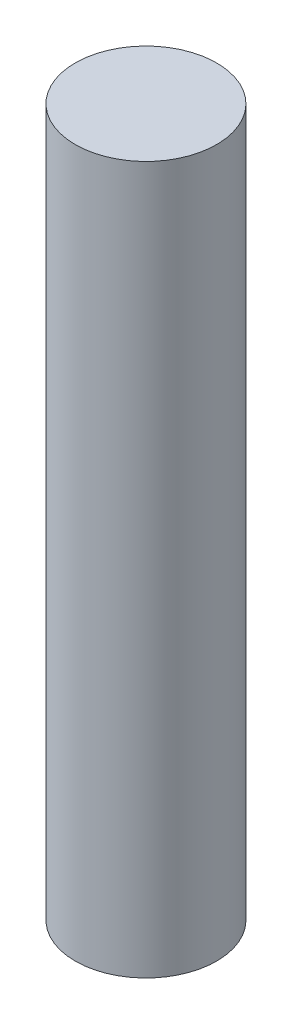
ISO-10303-21;
HEADER;
FILE_DESCRIPTION(('STEP AP214'),'2;1');
FILE_NAME('part.step','',(''),(''),'','','');
FILE_SCHEMA(('AUTOMOTIVE_DESIGN { 1 0 10303 214 1 1 1 1 }'));
ENDSEC;
DATA;
#1=APPLICATION_CONTEXT('core data for automotive mechanical design processes');
#2=APPLICATION_PROTOCOL_DEFINITION('international standard','automotive_design',2000,#1);
#3=PRODUCT_CONTEXT('',#1,'mechanical');
#4=PRODUCT('Part','Part','',(#3));
#5=PRODUCT_RELATED_PRODUCT_CATEGORY('part','',(#4));
#6=PRODUCT_DEFINITION_FORMATION('','',#4);
#7=PRODUCT_DEFINITION_CONTEXT('part definition',#1,'design');
#8=PRODUCT_DEFINITION('design','',#6,#7);
#9=PRODUCT_DEFINITION_SHAPE('','',#8);
#10=(LENGTH_UNIT() NAMED_UNIT(*) SI_UNIT(.MILLI.,.METRE.));
#11=(NAMED_UNIT(*) PLANE_ANGLE_UNIT() SI_UNIT($,.RADIAN.));
#12=(NAMED_UNIT(*) SI_UNIT($,.STERADIAN.) SOLID_ANGLE_UNIT());
#13=UNCERTAINTY_MEASURE_WITH_UNIT(LENGTH_MEASURE(1.E-05),#10,'distance_accuracy_value','');
#14=(GEOMETRIC_REPRESENTATION_CONTEXT(3) GLOBAL_UNCERTAINTY_ASSIGNED_CONTEXT((#13)) GLOBAL_UNIT_ASSIGNED_CONTEXT((#10,
#11,#12)) REPRESENTATION_CONTEXT('',''));
#15=CARTESIAN_POINT('',(0.,0.,0.));
#16=DIRECTION('',(0.,0.,1.));
#17=DIRECTION('',(1.,0.,0.));
#18=AXIS2_PLACEMENT_3D('',#15,#16,#17);
#19=CARTESIAN_POINT('',(0.,1500.,0.));
#20=DIRECTION('',(0.,-1.,0.));
#21=DIRECTION('',(0.,0.,-1.));
#22=AXIS2_PLACEMENT_3D('',#19,#20,#21);
#23=CYLINDRICAL_SURFACE('',#22,150.);
#24=CARTESIAN_POINT('',(0.,1500.,0.));
#25=DIRECTION('',(0.,1.,0.));
#26=DIRECTION('',(0.,0.,1.));
#27=AXIS2_PLACEMENT_3D('',#24,#25,#26);
#28=CIRCLE('',#27,150.);
#29=CARTESIAN_POINT('',(0.,1500.,150.));
#30=VERTEX_POINT('',#29);
#31=EDGE_CURVE('E10',#30,#30,#28,.T.);
#32=ORIENTED_EDGE('',*,*,#31,.F.);
#33=EDGE_LOOP('',(#32));
#34=FACE_BOUND('',#33,.T.);
#35=CARTESIAN_POINT('',(0.,0.,0.));
#36=DIRECTION('',(0.,1.,0.));
#37=DIRECTION('',(0.,0.,1.));
#38=AXIS2_PLACEMENT_3D('',#35,#36,#37);
#39=CIRCLE('',#38,150.);
#40=CARTESIAN_POINT('',(0.,0.,150.));
#41=VERTEX_POINT('',#40);
#42=EDGE_CURVE('E42',#41,#41,#39,.T.);
#43=ORIENTED_EDGE('',*,*,#42,.T.);
#44=EDGE_LOOP('',(#43));
#45=FACE_BOUND('',#44,.T.);
#46=ADVANCED_FACE('F39',(#34,#45),#23,.T.);
#47=CARTESIAN_POINT('',(0.,1500.,0.));
#48=DIRECTION('',(0.,1.,0.));
#49=DIRECTION('',(0.,0.,1.));
#50=AXIS2_PLACEMENT_3D('',#47,#48,#49);
#51=PLANE('',#50);
#52=ORIENTED_EDGE('',*,*,#31,.T.);
#53=EDGE_LOOP('',(#52));
#54=FACE_BOUND('',#53,.T.);
#55=ADVANCED_FACE('F54',(#54),#51,.T.);
#56=CARTESIAN_POINT('',(0.,0.,0.));
#57=DIRECTION('',(0.,1.,0.));
#58=DIRECTION('',(0.,0.,1.));
#59=AXIS2_PLACEMENT_3D('',#56,#57,#58);
#60=PLANE('',#59);
#61=ORIENTED_EDGE('',*,*,#42,.F.);
#62=EDGE_LOOP('',(#61));
#63=FACE_BOUND('',#62,.T.);
#64=ADVANCED_FACE('F52',(#63),#60,.F.);
#65=CLOSED_SHELL('',(#46,#55,#64));
#66=MANIFOLD_SOLID_BREP('B2',#65);
#67=ADVANCED_BREP_SHAPE_REPRESENTATION('',(#18,#66),#14);
#68=SHAPE_DEFINITION_REPRESENTATION(#9,#67);
ENDSEC;
END-ISO-10303-21;
